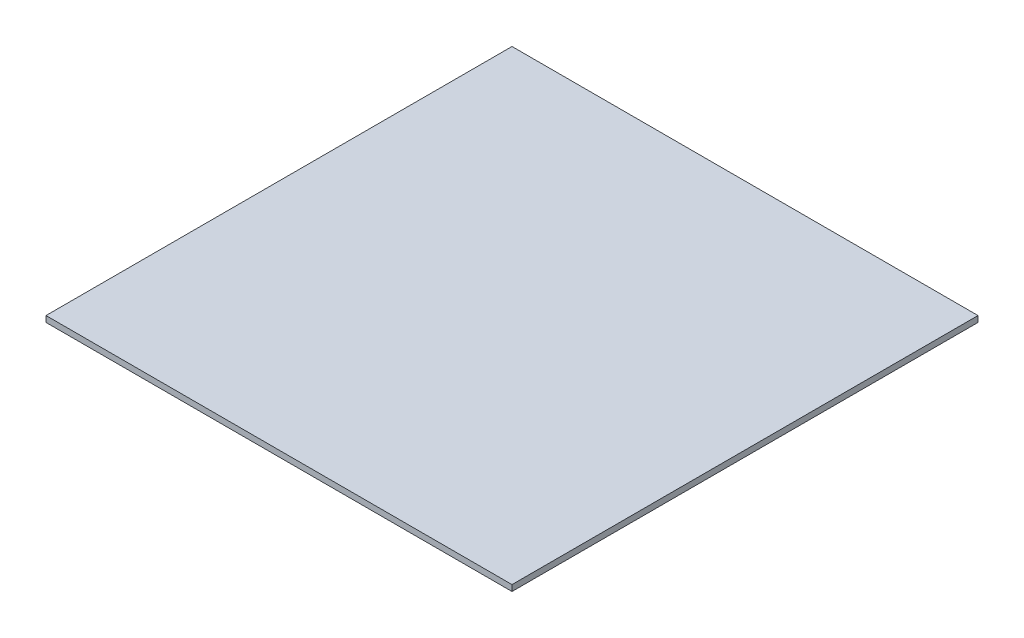
ISO-10303-21;
HEADER;
FILE_DESCRIPTION(('STEP AP214'),'2;1');
FILE_NAME('part.step','',(''),(''),'','','');
FILE_SCHEMA(('AUTOMOTIVE_DESIGN { 1 0 10303 214 1 1 1 1 }'));
ENDSEC;
DATA;
#1=APPLICATION_CONTEXT('core data for automotive mechanical design processes');
#2=APPLICATION_PROTOCOL_DEFINITION('international standard','automotive_design',2000,#1);
#3=PRODUCT_CONTEXT('',#1,'mechanical');
#4=PRODUCT('Part','Part','',(#3));
#5=PRODUCT_RELATED_PRODUCT_CATEGORY('part','',(#4));
#6=PRODUCT_DEFINITION_FORMATION('','',#4);
#7=PRODUCT_DEFINITION_CONTEXT('part definition',#1,'design');
#8=PRODUCT_DEFINITION('design','',#6,#7);
#9=PRODUCT_DEFINITION_SHAPE('','',#8);
#10=(LENGTH_UNIT() NAMED_UNIT(*) SI_UNIT(.MILLI.,.METRE.));
#11=(NAMED_UNIT(*) PLANE_ANGLE_UNIT() SI_UNIT($,.RADIAN.));
#12=(NAMED_UNIT(*) SI_UNIT($,.STERADIAN.) SOLID_ANGLE_UNIT());
#13=UNCERTAINTY_MEASURE_WITH_UNIT(LENGTH_MEASURE(1.E-05),#10,'distance_accuracy_value','');
#14=(GEOMETRIC_REPRESENTATION_CONTEXT(3) GLOBAL_UNCERTAINTY_ASSIGNED_CONTEXT((#13)) GLOBAL_UNIT_ASSIGNED_CONTEXT((#10,
#11,#12)) REPRESENTATION_CONTEXT('',''));
#15=CARTESIAN_POINT('',(0.,0.,0.));
#16=DIRECTION('',(0.,0.,1.));
#17=DIRECTION('',(1.,0.,0.));
#18=AXIS2_PLACEMENT_3D('',#15,#16,#17);
#19=CARTESIAN_POINT('',(0.,4.,0.));
#20=DIRECTION('',(1.,0.,0.));
#21=DIRECTION('',(0.,0.,-1.));
#22=AXIS2_PLACEMENT_3D('',#19,#20,#21);
#23=PLANE('',#22);
#24=DIRECTION('',(0.,0.,1.));
#25=VECTOR('',#24,1.);
#26=CARTESIAN_POINT('',(0.,0.,0.));
#27=LINE('',#26,#25);
#28=CARTESIAN_POINT('',(0.,0.,-310.));
#29=VERTEX_POINT('',#28);
#30=CARTESIAN_POINT('',(0.,0.,0.));
#31=VERTEX_POINT('',#30);
#32=EDGE_CURVE('E98',#29,#31,#27,.T.);
#33=ORIENTED_EDGE('',*,*,#32,.T.);
#34=DIRECTION('',(0.,-1.,0.));
#35=VECTOR('',#34,1.);
#36=CARTESIAN_POINT('',(0.,4.,0.));
#37=LINE('',#36,#35);
#38=CARTESIAN_POINT('',(0.,4.,0.));
#39=VERTEX_POINT('',#38);
#40=EDGE_CURVE('E11',#39,#31,#37,.T.);
#41=ORIENTED_EDGE('',*,*,#40,.F.);
#42=DIRECTION('',(0.,0.,1.));
#43=VECTOR('',#42,1.);
#44=CARTESIAN_POINT('',(0.,4.,0.));
#45=LINE('',#44,#43);
#46=CARTESIAN_POINT('',(0.,4.,-310.));
#47=VERTEX_POINT('',#46);
#48=EDGE_CURVE('E86',#47,#39,#45,.T.);
#49=ORIENTED_EDGE('',*,*,#48,.F.);
#50=DIRECTION('',(0.,-1.,0.));
#51=VECTOR('',#50,1.);
#52=CARTESIAN_POINT('',(0.,4.,-310.));
#53=LINE('',#52,#51);
#54=EDGE_CURVE('E94',#47,#29,#53,.T.);
#55=ORIENTED_EDGE('',*,*,#54,.T.);
#56=EDGE_LOOP('',(#33,#41,#49,#55));
#57=FACE_BOUND('',#56,.T.);
#58=ADVANCED_FACE('F35',(#57),#23,.F.);
#59=CARTESIAN_POINT('',(0.,4.,0.));
#60=DIRECTION('',(0.,0.,-1.));
#61=DIRECTION('',(-1.,0.,0.));
#62=AXIS2_PLACEMENT_3D('',#59,#60,#61);
#63=PLANE('',#62);
#64=DIRECTION('',(1.,0.,0.));
#65=VECTOR('',#64,1.);
#66=CARTESIAN_POINT('',(0.,0.,0.));
#67=LINE('',#66,#65);
#68=CARTESIAN_POINT('',(310.,0.,0.));
#69=VERTEX_POINT('',#68);
#70=EDGE_CURVE('E90',#31,#69,#67,.T.);
#71=ORIENTED_EDGE('',*,*,#70,.T.);
#72=DIRECTION('',(0.,-1.,0.));
#73=VECTOR('',#72,1.);
#74=CARTESIAN_POINT('',(310.,4.,0.));
#75=LINE('',#74,#73);
#76=CARTESIAN_POINT('',(310.,4.,0.));
#77=VERTEX_POINT('',#76);
#78=EDGE_CURVE('E43',#77,#69,#75,.T.);
#79=ORIENTED_EDGE('',*,*,#78,.F.);
#80=DIRECTION('',(1.,0.,0.));
#81=VECTOR('',#80,1.);
#82=CARTESIAN_POINT('',(0.,4.,0.));
#83=LINE('',#82,#81);
#84=EDGE_CURVE('E81',#39,#77,#83,.T.);
#85=ORIENTED_EDGE('',*,*,#84,.F.);
#86=ORIENTED_EDGE('',*,*,#40,.T.);
#87=EDGE_LOOP('',(#71,#79,#85,#86));
#88=FACE_BOUND('',#87,.T.);
#89=ADVANCED_FACE('F89',(#88),#63,.F.);
#90=CARTESIAN_POINT('',(310.,4.,0.));
#91=DIRECTION('',(-1.,0.,0.));
#92=DIRECTION('',(0.,0.,1.));
#93=AXIS2_PLACEMENT_3D('',#90,#91,#92);
#94=PLANE('',#93);
#95=DIRECTION('',(0.,0.,-1.));
#96=VECTOR('',#95,1.);
#97=CARTESIAN_POINT('',(310.,0.,0.));
#98=LINE('',#97,#96);
#99=CARTESIAN_POINT('',(310.,0.,-310.));
#100=VERTEX_POINT('',#99);
#101=EDGE_CURVE('E68',#69,#100,#98,.T.);
#102=ORIENTED_EDGE('',*,*,#101,.T.);
#103=DIRECTION('',(0.,-1.,0.));
#104=VECTOR('',#103,1.);
#105=CARTESIAN_POINT('',(310.,4.,-310.));
#106=LINE('',#105,#104);
#107=CARTESIAN_POINT('',(310.,4.,-310.));
#108=VERTEX_POINT('',#107);
#109=EDGE_CURVE('E91',#108,#100,#106,.T.);
#110=ORIENTED_EDGE('',*,*,#109,.F.);
#111=DIRECTION('',(0.,0.,-1.));
#112=VECTOR('',#111,1.);
#113=CARTESIAN_POINT('',(310.,4.,0.));
#114=LINE('',#113,#112);
#115=EDGE_CURVE('E84',#77,#108,#114,.T.);
#116=ORIENTED_EDGE('',*,*,#115,.F.);
#117=ORIENTED_EDGE('',*,*,#78,.T.);
#118=EDGE_LOOP('',(#102,#110,#116,#117));
#119=FACE_BOUND('',#118,.T.);
#120=ADVANCED_FACE('F92',(#119),#94,.F.);
#121=CARTESIAN_POINT('',(0.,4.,-310.));
#122=DIRECTION('',(0.,0.,1.));
#123=DIRECTION('',(1.,0.,0.));
#124=AXIS2_PLACEMENT_3D('',#121,#122,#123);
#125=PLANE('',#124);
#126=DIRECTION('',(-1.,0.,0.));
#127=VECTOR('',#126,1.);
#128=CARTESIAN_POINT('',(0.,0.,-310.));
#129=LINE('',#128,#127);
#130=EDGE_CURVE('E74',#100,#29,#129,.T.);
#131=ORIENTED_EDGE('',*,*,#130,.T.);
#132=ORIENTED_EDGE('',*,*,#54,.F.);
#133=DIRECTION('',(-1.,0.,0.));
#134=VECTOR('',#133,1.);
#135=CARTESIAN_POINT('',(0.,4.,-310.));
#136=LINE('',#135,#134);
#137=EDGE_CURVE('E51',#108,#47,#136,.T.);
#138=ORIENTED_EDGE('',*,*,#137,.F.);
#139=ORIENTED_EDGE('',*,*,#109,.T.);
#140=EDGE_LOOP('',(#131,#132,#138,#139));
#141=FACE_BOUND('',#140,.T.);
#142=ADVANCED_FACE('F106',(#141),#125,.F.);
#143=CARTESIAN_POINT('',(0.,4.,0.));
#144=DIRECTION('',(0.,-1.,0.));
#145=DIRECTION('',(0.,0.,-1.));
#146=AXIS2_PLACEMENT_3D('',#143,#144,#145);
#147=PLANE('',#146);
#148=ORIENTED_EDGE('',*,*,#48,.T.);
#149=ORIENTED_EDGE('',*,*,#84,.T.);
#150=ORIENTED_EDGE('',*,*,#115,.T.);
#151=ORIENTED_EDGE('',*,*,#137,.T.);
#152=EDGE_LOOP('',(#148,#149,#150,#151));
#153=FACE_BOUND('',#152,.T.);
#154=ADVANCED_FACE('F82',(#153),#147,.F.);
#155=CARTESIAN_POINT('',(0.,0.,0.));
#156=DIRECTION('',(0.,-1.,0.));
#157=DIRECTION('',(0.,0.,-1.));
#158=AXIS2_PLACEMENT_3D('',#155,#156,#157);
#159=PLANE('',#158);
#160=CARTESIAN_POINT('',(37.5,0.,-272.5));
#161=DIRECTION('',(0.,-1.,0.));
#162=DIRECTION('',(0.,0.,-1.));
#163=AXIS2_PLACEMENT_3D('',#160,#161,#162);
#164=CIRCLE('',#163,2.);
#165=CARTESIAN_POINT('',(37.5,0.,-274.5));
#166=VERTEX_POINT('',#165);
#167=EDGE_CURVE('E130',#166,#166,#164,.T.);
#168=ORIENTED_EDGE('',*,*,#167,.F.);
#169=EDGE_LOOP('',(#168));
#170=FACE_BOUND('',#169,.T.);
#171=CARTESIAN_POINT('',(37.5,0.,-37.5));
#172=DIRECTION('',(0.,-1.,0.));
#173=DIRECTION('',(0.,0.,-1.));
#174=AXIS2_PLACEMENT_3D('',#171,#172,#173);
#175=CIRCLE('',#174,2.);
#176=CARTESIAN_POINT('',(37.5,0.,-39.5));
#177=VERTEX_POINT('',#176);
#178=EDGE_CURVE('E124',#177,#177,#175,.T.);
#179=ORIENTED_EDGE('',*,*,#178,.F.);
#180=EDGE_LOOP('',(#179));
#181=FACE_BOUND('',#180,.T.);
#182=CARTESIAN_POINT('',(272.5,0.,-272.5));
#183=DIRECTION('',(0.,-1.,0.));
#184=DIRECTION('',(0.,0.,-1.));
#185=AXIS2_PLACEMENT_3D('',#182,#183,#184);
#186=CIRCLE('',#185,2.);
#187=CARTESIAN_POINT('',(272.5,0.,-274.5));
#188=VERTEX_POINT('',#187);
#189=EDGE_CURVE('E118',#188,#188,#186,.T.);
#190=ORIENTED_EDGE('',*,*,#189,.F.);
#191=EDGE_LOOP('',(#190));
#192=FACE_BOUND('',#191,.T.);
#193=CARTESIAN_POINT('',(272.5,0.,-37.5));
#194=DIRECTION('',(0.,-1.,0.));
#195=DIRECTION('',(0.,0.,-1.));
#196=AXIS2_PLACEMENT_3D('',#193,#194,#195);
#197=CIRCLE('',#196,2.);
#198=CARTESIAN_POINT('',(272.5,0.,-39.4999999999999));
#199=VERTEX_POINT('',#198);
#200=EDGE_CURVE('E112',#199,#199,#197,.T.);
#201=ORIENTED_EDGE('',*,*,#200,.F.);
#202=EDGE_LOOP('',(#201));
#203=FACE_BOUND('',#202,.T.);
#204=ORIENTED_EDGE('',*,*,#32,.F.);
#205=ORIENTED_EDGE('',*,*,#130,.F.);
#206=ORIENTED_EDGE('',*,*,#101,.F.);
#207=ORIENTED_EDGE('',*,*,#70,.F.);
#208=EDGE_LOOP('',(#204,#205,#206,#207));
#209=FACE_BOUND('',#208,.T.);
#210=ADVANCED_FACE('F109',(#170,#181,#192,#203,#209),#159,.T.);
#211=CARTESIAN_POINT('',(272.5,-25.,-37.5));
#212=DIRECTION('',(0.,1.,0.));
#213=DIRECTION('',(0.,0.,1.));
#214=AXIS2_PLACEMENT_3D('',#211,#212,#213);
#215=CYLINDRICAL_SURFACE('',#214,2.);
#216=CARTESIAN_POINT('',(272.5,-25.,-37.5));
#217=DIRECTION('',(0.,-1.,0.));
#218=DIRECTION('',(0.,0.,-1.));
#219=AXIS2_PLACEMENT_3D('',#216,#217,#218);
#220=CIRCLE('',#219,2.);
#221=CARTESIAN_POINT('',(272.5,-25.,-39.4999999999999));
#222=VERTEX_POINT('',#221);
#223=EDGE_CURVE('E101',#222,#222,#220,.T.);
#224=ORIENTED_EDGE('',*,*,#223,.F.);
#225=EDGE_LOOP('',(#224));
#226=FACE_BOUND('',#225,.T.);
#227=ORIENTED_EDGE('',*,*,#200,.T.);
#228=EDGE_LOOP('',(#227));
#229=FACE_BOUND('',#228,.T.);
#230=ADVANCED_FACE('F147',(#226,#229),#215,.T.);
#231=CARTESIAN_POINT('',(272.5,-25.,-37.5));
#232=DIRECTION('',(0.,-1.,0.));
#233=DIRECTION('',(0.,0.,-1.));
#234=AXIS2_PLACEMENT_3D('',#231,#232,#233);
#235=PLANE('',#234);
#236=ORIENTED_EDGE('',*,*,#223,.T.);
#237=EDGE_LOOP('',(#236));
#238=FACE_BOUND('',#237,.T.);
#239=ADVANCED_FACE('F156',(#238),#235,.T.);
#240=CARTESIAN_POINT('',(272.5,-25.,-272.5));
#241=DIRECTION('',(0.,1.,0.));
#242=DIRECTION('',(0.,0.,1.));
#243=AXIS2_PLACEMENT_3D('',#240,#241,#242);
#244=CYLINDRICAL_SURFACE('',#243,2.);
#245=CARTESIAN_POINT('',(272.5,-25.,-272.5));
#246=DIRECTION('',(0.,-1.,0.));
#247=DIRECTION('',(0.,0.,-1.));
#248=AXIS2_PLACEMENT_3D('',#245,#246,#247);
#249=CIRCLE('',#248,2.);
#250=CARTESIAN_POINT('',(272.5,-25.,-274.5));
#251=VERTEX_POINT('',#250);
#252=EDGE_CURVE('E115',#251,#251,#249,.T.);
#253=ORIENTED_EDGE('',*,*,#252,.F.);
#254=EDGE_LOOP('',(#253));
#255=FACE_BOUND('',#254,.T.);
#256=ORIENTED_EDGE('',*,*,#189,.T.);
#257=EDGE_LOOP('',(#256));
#258=FACE_BOUND('',#257,.T.);
#259=ADVANCED_FACE('F162',(#255,#258),#244,.T.);
#260=CARTESIAN_POINT('',(272.5,-25.,-272.5));
#261=DIRECTION('',(0.,-1.,0.));
#262=DIRECTION('',(0.,0.,-1.));
#263=AXIS2_PLACEMENT_3D('',#260,#261,#262);
#264=PLANE('',#263);
#265=ORIENTED_EDGE('',*,*,#252,.T.);
#266=EDGE_LOOP('',(#265));
#267=FACE_BOUND('',#266,.T.);
#268=ADVANCED_FACE('F205',(#267),#264,.T.);
#269=CARTESIAN_POINT('',(37.5,-25.,-37.5));
#270=DIRECTION('',(0.,1.,0.));
#271=DIRECTION('',(0.,0.,1.));
#272=AXIS2_PLACEMENT_3D('',#269,#270,#271);
#273=CYLINDRICAL_SURFACE('',#272,2.);
#274=CARTESIAN_POINT('',(37.5,-25.,-37.5));
#275=DIRECTION('',(0.,-1.,0.));
#276=DIRECTION('',(0.,0.,-1.));
#277=AXIS2_PLACEMENT_3D('',#274,#275,#276);
#278=CIRCLE('',#277,2.);
#279=CARTESIAN_POINT('',(37.5,-25.,-39.5));
#280=VERTEX_POINT('',#279);
#281=EDGE_CURVE('E121',#280,#280,#278,.T.);
#282=ORIENTED_EDGE('',*,*,#281,.F.);
#283=EDGE_LOOP('',(#282));
#284=FACE_BOUND('',#283,.T.);
#285=ORIENTED_EDGE('',*,*,#178,.T.);
#286=EDGE_LOOP('',(#285));
#287=FACE_BOUND('',#286,.T.);
#288=ADVANCED_FACE('F215',(#284,#287),#273,.T.);
#289=CARTESIAN_POINT('',(37.5,-25.,-37.5));
#290=DIRECTION('',(0.,-1.,0.));
#291=DIRECTION('',(0.,0.,-1.));
#292=AXIS2_PLACEMENT_3D('',#289,#290,#291);
#293=PLANE('',#292);
#294=ORIENTED_EDGE('',*,*,#281,.T.);
#295=EDGE_LOOP('',(#294));
#296=FACE_BOUND('',#295,.T.);
#297=ADVANCED_FACE('F141',(#296),#293,.T.);
#298=CARTESIAN_POINT('',(37.5,-25.,-272.5));
#299=DIRECTION('',(0.,1.,0.));
#300=DIRECTION('',(0.,0.,1.));
#301=AXIS2_PLACEMENT_3D('',#298,#299,#300);
#302=CYLINDRICAL_SURFACE('',#301,2.);
#303=CARTESIAN_POINT('',(37.5,-25.,-272.5));
#304=DIRECTION('',(0.,-1.,0.));
#305=DIRECTION('',(0.,0.,-1.));
#306=AXIS2_PLACEMENT_3D('',#303,#304,#305);
#307=CIRCLE('',#306,2.);
#308=CARTESIAN_POINT('',(37.5,-25.,-274.5));
#309=VERTEX_POINT('',#308);
#310=EDGE_CURVE('E127',#309,#309,#307,.T.);
#311=ORIENTED_EDGE('',*,*,#310,.F.);
#312=EDGE_LOOP('',(#311));
#313=FACE_BOUND('',#312,.T.);
#314=ORIENTED_EDGE('',*,*,#167,.T.);
#315=EDGE_LOOP('',(#314));
#316=FACE_BOUND('',#315,.T.);
#317=ADVANCED_FACE('F138',(#313,#316),#302,.T.);
#318=CARTESIAN_POINT('',(37.5,-25.,-272.5));
#319=DIRECTION('',(0.,-1.,0.));
#320=DIRECTION('',(0.,0.,-1.));
#321=AXIS2_PLACEMENT_3D('',#318,#319,#320);
#322=PLANE('',#321);
#323=ORIENTED_EDGE('',*,*,#310,.T.);
#324=EDGE_LOOP('',(#323));
#325=FACE_BOUND('',#324,.T.);
#326=ADVANCED_FACE('F136',(#325),#322,.T.);
#327=CLOSED_SHELL('',(#58,#89,#120,#142,#154,#210,#230,#239,#259,#268,#288,#297,#317,#326));
#328=MANIFOLD_SOLID_BREP('B2',#327);
#329=ADVANCED_BREP_SHAPE_REPRESENTATION('',(#18,#328),#14);
#330=SHAPE_DEFINITION_REPRESENTATION(#9,#329);
ENDSEC;
END-ISO-10303-21;
